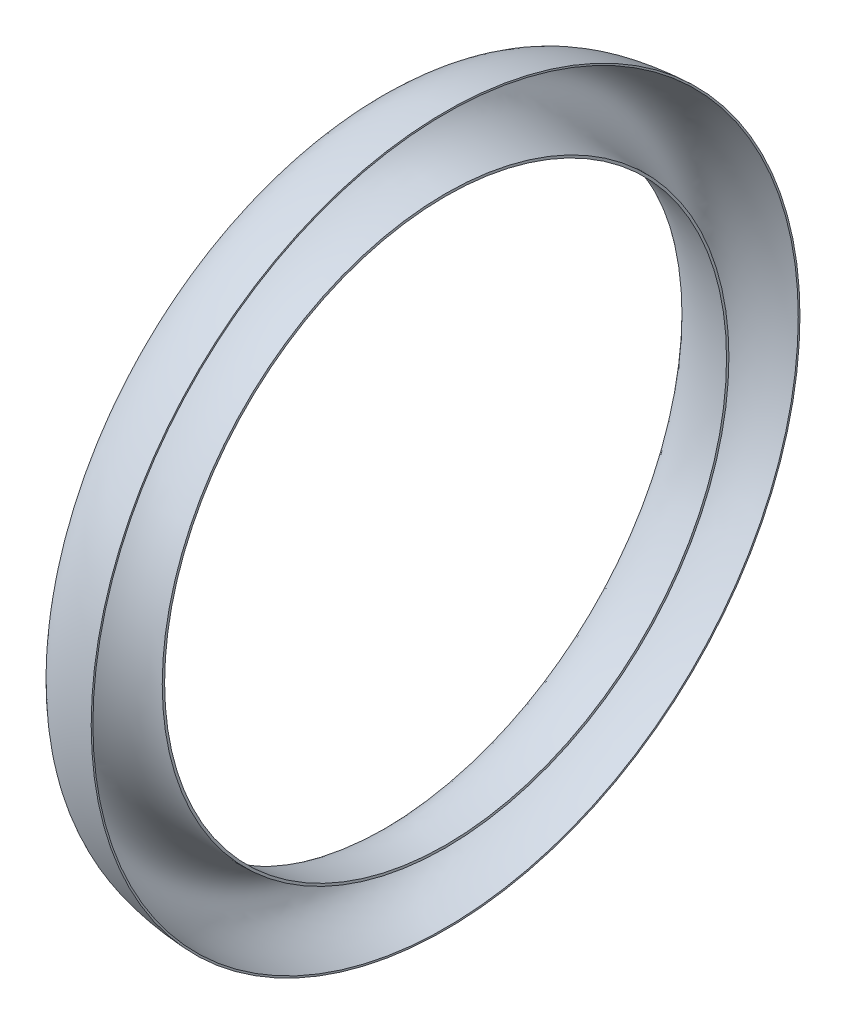
ISO-10303-21;
HEADER;
FILE_DESCRIPTION(('STEP AP214'),'2;1');
FILE_NAME('part.step','',(''),(''),'','','');
FILE_SCHEMA(('AUTOMOTIVE_DESIGN { 1 0 10303 214 1 1 1 1 }'));
ENDSEC;
DATA;
#1=APPLICATION_CONTEXT('core data for automotive mechanical design processes');
#2=APPLICATION_PROTOCOL_DEFINITION('international standard','automotive_design',2000,#1);
#3=PRODUCT_CONTEXT('',#1,'mechanical');
#4=PRODUCT('Part','Part','',(#3));
#5=PRODUCT_RELATED_PRODUCT_CATEGORY('part','',(#4));
#6=PRODUCT_DEFINITION_FORMATION('','',#4);
#7=PRODUCT_DEFINITION_CONTEXT('part definition',#1,'design');
#8=PRODUCT_DEFINITION('design','',#6,#7);
#9=PRODUCT_DEFINITION_SHAPE('','',#8);
#10=(LENGTH_UNIT() NAMED_UNIT(*) SI_UNIT(.MILLI.,.METRE.));
#11=(NAMED_UNIT(*) PLANE_ANGLE_UNIT() SI_UNIT($,.RADIAN.));
#12=(NAMED_UNIT(*) SI_UNIT($,.STERADIAN.) SOLID_ANGLE_UNIT());
#13=UNCERTAINTY_MEASURE_WITH_UNIT(LENGTH_MEASURE(1.E-05),#10,'distance_accuracy_value','');
#14=(GEOMETRIC_REPRESENTATION_CONTEXT(3) GLOBAL_UNCERTAINTY_ASSIGNED_CONTEXT((#13)) GLOBAL_UNIT_ASSIGNED_CONTEXT((#10,
#11,#12)) REPRESENTATION_CONTEXT('',''));
#15=CARTESIAN_POINT('',(0.,0.,0.));
#16=DIRECTION('',(0.,0.,1.));
#17=DIRECTION('',(1.,0.,0.));
#18=AXIS2_PLACEMENT_3D('',#15,#16,#17);
#19=CARTESIAN_POINT('',(81.7225640681179,1240.09569710784,0.171759985086747));
#20=CARTESIAN_POINT('',(-136.010832560989,1228.05759109101,0.171759985086747));
#21=CARTESIAN_POINT('',(-184.469162649874,1112.30048858281,0.171759985086747));
#22=CARTESIAN_POINT('',(-132.212140106791,993.823087670887,0.171759985086747));
#23=CARTESIAN_POINT('',(81.7225640681179,983.14513085592,0.171759985086747));
#24=B_SPLINE_CURVE_WITH_KNOTS('',3,(#19,#20,#21,#22,#23),.UNSPECIFIED.,.F.,.F.,(4,1,4),(0.,0.5,
1.),.UNSPECIFIED.);
#25=CARTESIAN_POINT('',(-4479.57046986854,-2.97493478024572E-13,0.171759985086747));
#26=DIRECTION('',(-1.,0.,0.));
#27=AXIS1_PLACEMENT('',#25,#26);
#28=SURFACE_OF_REVOLUTION('',#24,#27);
#29=CARTESIAN_POINT('',(81.7225640681179,-2.97493478024572E-13,0.171759985086747));
#30=DIRECTION('',(-1.,0.,0.));
#31=DIRECTION('',(0.,0.,1.));
#32=AXIS2_PLACEMENT_3D('',#29,#30,#31);
#33=CIRCLE('',#32,983.14513085592);
#34=CARTESIAN_POINT('',(81.7225640681179,-2.97493478024572E-13,983.316890841007));
#35=VERTEX_POINT('',#34);
#36=EDGE_CURVE('E12',#35,#35,#33,.T.);
#37=ORIENTED_EDGE('',*,*,#36,.F.);
#38=EDGE_LOOP('',(#37));
#39=FACE_BOUND('',#38,.T.);
#40=CARTESIAN_POINT('',(81.7225640681179,-2.97493478024572E-13,0.171759985086747));
#41=DIRECTION('',(-1.,0.,0.));
#42=DIRECTION('',(0.,0.,1.));
#43=AXIS2_PLACEMENT_3D('',#40,#41,#42);
#44=CIRCLE('',#43,1240.09569710784);
#45=CARTESIAN_POINT('',(81.7225640681179,-2.97493478024572E-13,1240.26745709293));
#46=VERTEX_POINT('',#45);
#47=EDGE_CURVE('E66',#46,#46,#44,.T.);
#48=ORIENTED_EDGE('',*,*,#47,.T.);
#49=EDGE_LOOP('',(#48));
#50=FACE_BOUND('',#49,.T.);
#51=ADVANCED_FACE('F51',(#39,#50),#28,.T.);
#52=CARTESIAN_POINT('',(81.7225640681179,991.5082850587,0.171759985086747));
#53=DIRECTION('',(-1.,0.,0.));
#54=DIRECTION('',(0.,0.,1.));
#55=AXIS2_PLACEMENT_3D('',#52,#53,#54);
#56=PLANE('',#55);
#57=CARTESIAN_POINT('',(81.7225640681179,-2.97493478024572E-13,0.171759985086747));
#58=DIRECTION('',(-1.,0.,0.));
#59=DIRECTION('',(0.,0.,1.));
#60=AXIS2_PLACEMENT_3D('',#57,#58,#59);
#61=CIRCLE('',#60,991.5082850587);
#62=CARTESIAN_POINT('',(81.7225640681179,-2.97493478024572E-13,991.680045043787));
#63=VERTEX_POINT('',#62);
#64=EDGE_CURVE('E58',#63,#63,#61,.T.);
#65=ORIENTED_EDGE('',*,*,#64,.F.);
#66=EDGE_LOOP('',(#65));
#67=FACE_BOUND('',#66,.T.);
#68=ORIENTED_EDGE('',*,*,#36,.T.);
#69=EDGE_LOOP('',(#68));
#70=FACE_BOUND('',#69,.T.);
#71=ADVANCED_FACE('F85',(#67,#70),#56,.F.);
#72=CARTESIAN_POINT('',(81.7225640681179,991.5082850587,0.171759985086747));
#73=CARTESIAN_POINT('',(-50.3152648874369,985.778942013262,0.171759985086747));
#74=CARTESIAN_POINT('',(-251.977885198036,1116.56112922669,0.171759985086747));
#75=CARTESIAN_POINT('',(-62.6171566984136,1228.58068383688,0.171759985086747));
#76=CARTESIAN_POINT('',(81.7225640681183,1234.12242965713,0.171759985086747));
#77=B_SPLINE_CURVE_WITH_KNOTS('',3,(#72,#73,#74,#75,#76),.UNSPECIFIED.,.F.,.F.,(4,1,4),(0.,
0.498970200153516,1.),.UNSPECIFIED.);
#78=CARTESIAN_POINT('',(-4479.57046986854,-2.97493478024572E-13,0.171759985086747));
#79=DIRECTION('',(-1.,0.,0.));
#80=AXIS1_PLACEMENT('',#78,#79);
#81=SURFACE_OF_REVOLUTION('',#77,#80);
#82=CARTESIAN_POINT('',(81.7225640681185,-2.97493478024572E-13,0.171759985086747));
#83=DIRECTION('',(-1.,0.,0.));
#84=DIRECTION('',(0.,0.,1.));
#85=AXIS2_PLACEMENT_3D('',#82,#83,#84);
#86=CIRCLE('',#85,1234.12242965714);
#87=CARTESIAN_POINT('',(81.7225640681185,-2.97493478024572E-13,1234.29418964222));
#88=VERTEX_POINT('',#87);
#89=EDGE_CURVE('E62',#88,#88,#86,.T.);
#90=ORIENTED_EDGE('',*,*,#89,.F.);
#91=EDGE_LOOP('',(#90));
#92=FACE_BOUND('',#91,.T.);
#93=ORIENTED_EDGE('',*,*,#64,.T.);
#94=EDGE_LOOP('',(#93));
#95=FACE_BOUND('',#94,.T.);
#96=ADVANCED_FACE('F81',(#92,#95),#81,.T.);
#97=CARTESIAN_POINT('',(81.7225640681181,1240.09569710784,0.171759985086747));
#98=DIRECTION('',(-1.,0.,0.));
#99=DIRECTION('',(0.,0.,1.));
#100=AXIS2_PLACEMENT_3D('',#97,#98,#99);
#101=PLANE('',#100);
#102=ORIENTED_EDGE('',*,*,#47,.F.);
#103=EDGE_LOOP('',(#102));
#104=FACE_BOUND('',#103,.T.);
#105=ORIENTED_EDGE('',*,*,#89,.T.);
#106=EDGE_LOOP('',(#105));
#107=FACE_BOUND('',#106,.T.);
#108=ADVANCED_FACE('F84',(#104,#107),#101,.F.);
#109=CLOSED_SHELL('',(#51,#71,#96,#108));
#110=MANIFOLD_SOLID_BREP('B2',#109);
#111=ADVANCED_BREP_SHAPE_REPRESENTATION('',(#18,#110),#14);
#112=SHAPE_DEFINITION_REPRESENTATION(#9,#111);
ENDSEC;
END-ISO-10303-21;
